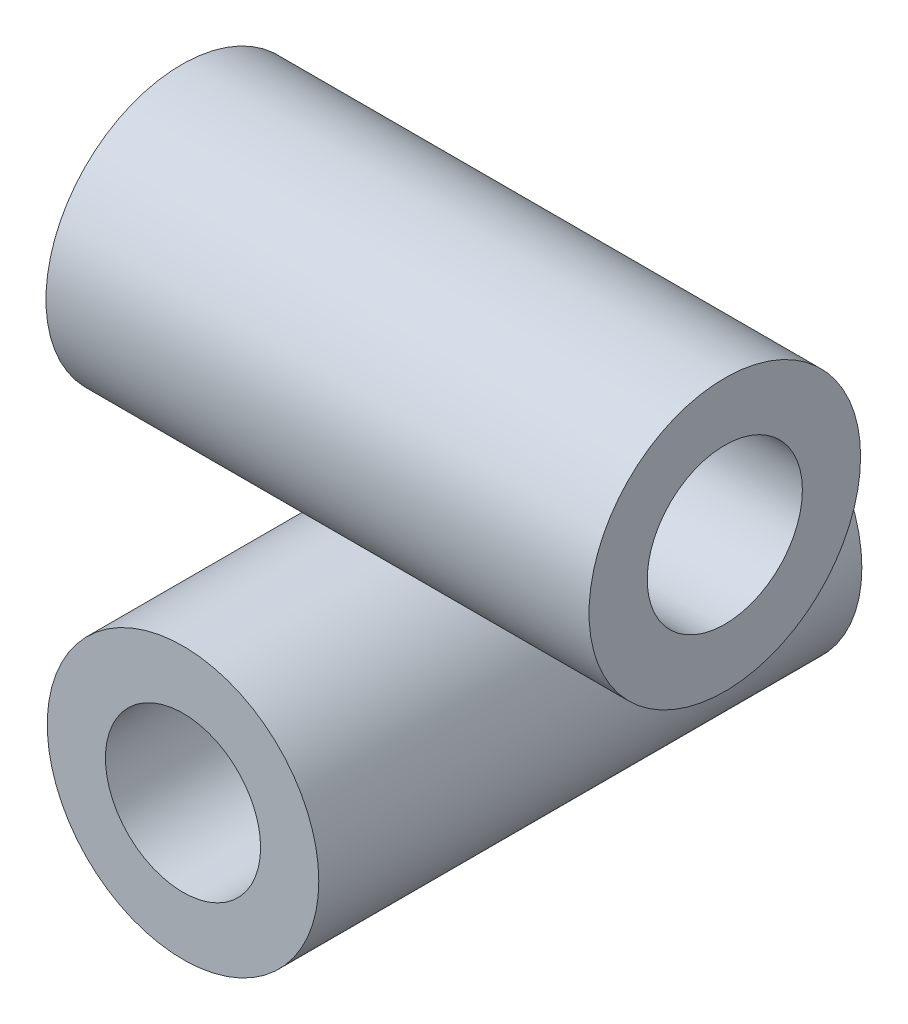
ISO-10303-21;
HEADER;
FILE_DESCRIPTION(('STEP AP214'),'2;1');
FILE_NAME('part.step','',(''),(''),'','','');
FILE_SCHEMA(('AUTOMOTIVE_DESIGN { 1 0 10303 214 1 1 1 1 }'));
ENDSEC;
DATA;
#1=APPLICATION_CONTEXT('core data for automotive mechanical design processes');
#2=APPLICATION_PROTOCOL_DEFINITION('international standard','automotive_design',2000,#1);
#3=PRODUCT_CONTEXT('',#1,'mechanical');
#4=PRODUCT('Part','Part','',(#3));
#5=PRODUCT_RELATED_PRODUCT_CATEGORY('part','',(#4));
#6=PRODUCT_DEFINITION_FORMATION('','',#4);
#7=PRODUCT_DEFINITION_CONTEXT('part definition',#1,'design');
#8=PRODUCT_DEFINITION('design','',#6,#7);
#9=PRODUCT_DEFINITION_SHAPE('','',#8);
#10=(LENGTH_UNIT() NAMED_UNIT(*) SI_UNIT(.MILLI.,.METRE.));
#11=(NAMED_UNIT(*) PLANE_ANGLE_UNIT() SI_UNIT($,.RADIAN.));
#12=(NAMED_UNIT(*) SI_UNIT($,.STERADIAN.) SOLID_ANGLE_UNIT());
#13=UNCERTAINTY_MEASURE_WITH_UNIT(LENGTH_MEASURE(1.E-05),#10,'distance_accuracy_value','');
#14=(GEOMETRIC_REPRESENTATION_CONTEXT(3) GLOBAL_UNCERTAINTY_ASSIGNED_CONTEXT((#13)) GLOBAL_UNIT_ASSIGNED_CONTEXT((#10,
#11,#12)) REPRESENTATION_CONTEXT('',''));
#15=CARTESIAN_POINT('',(0.,0.,0.));
#16=DIRECTION('',(0.,0.,1.));
#17=DIRECTION('',(1.,0.,0.));
#18=AXIS2_PLACEMENT_3D('',#15,#16,#17);
#19=CARTESIAN_POINT('',(0.,0.,56.));
#20=DIRECTION('',(0.,0.,-1.));
#21=DIRECTION('',(-1.,0.,0.));
#22=AXIS2_PLACEMENT_3D('',#19,#20,#21);
#23=CYLINDRICAL_SURFACE('',#22,14.);
#24=CARTESIAN_POINT('',(0.,0.,56.));
#25=DIRECTION('',(0.,0.,1.));
#26=DIRECTION('',(1.,0.,0.));
#27=AXIS2_PLACEMENT_3D('',#24,#25,#26);
#28=CIRCLE('',#27,14.);
#29=CARTESIAN_POINT('',(14.,0.,56.));
#30=VERTEX_POINT('',#29);
#31=EDGE_CURVE('E48',#30,#30,#28,.T.);
#32=ORIENTED_EDGE('',*,*,#31,.F.);
#33=EDGE_LOOP('',(#32));
#34=FACE_BOUND('',#33,.T.);
#35=CARTESIAN_POINT('',(0.,0.,0.));
#36=DIRECTION('',(0.,0.,1.));
#37=DIRECTION('',(1.,0.,0.));
#38=AXIS2_PLACEMENT_3D('',#35,#36,#37);
#39=CIRCLE('',#38,14.);
#40=CARTESIAN_POINT('',(14.,0.,0.));
#41=VERTEX_POINT('',#40);
#42=EDGE_CURVE('E52',#41,#41,#39,.T.);
#43=ORIENTED_EDGE('',*,*,#42,.T.);
#44=EDGE_LOOP('',(#43));
#45=FACE_BOUND('',#44,.T.);
#46=CARTESIAN_POINT('',(0.,14.,37.9306246010519));
#47=CARTESIAN_POINT('',(0.265653625682401,14.0000061462166,37.9306222719299));
#48=CARTESIAN_POINT('',(0.53124276110626,13.9924319781962,37.9229160846011));
#49=CARTESIAN_POINT('',(1.06073651250941,13.9622742798804,37.8919982606608));
#50=CARTESIAN_POINT('',(1.32464087710114,13.9396885601986,37.8687843622974));
#51=CARTESIAN_POINT('',(1.84907543869876,13.87986436212,37.8065843969487));
#52=CARTESIAN_POINT('',(2.10960336959429,13.8426165209297,37.7675882514427));
#53=CARTESIAN_POINT('',(2.62530832760412,13.7541334909963,37.6734409076748));
#54=CARTESIAN_POINT('',(2.88048557172529,13.7028988706987,37.6182903659472));
#55=CARTESIAN_POINT('',(3.38408153489981,13.5873044840194,37.4912528146237));
#56=CARTESIAN_POINT('',(3.63248830849914,13.5229230316737,37.4193381241156));
#57=CARTESIAN_POINT('',(4.12024384514522,13.3823765235029,37.2583154538406));
#58=CARTESIAN_POINT('',(4.35959254202517,13.3062113816219,37.1692073485095));
#59=CARTESIAN_POINT('',(4.82727241633906,13.1437699463866,36.9733914668309));
#60=CARTESIAN_POINT('',(5.05560891813341,13.057498609956,36.866692308233));
#61=CARTESIAN_POINT('',(5.4996142639415,12.8767888022203,36.6353534877615));
#62=CARTESIAN_POINT('',(5.71528351741018,12.7823505951445,36.510714406226));
#63=CARTESIAN_POINT('',(6.12777160984667,12.5897220445385,36.2463395380369));
#64=CARTESIAN_POINT('',(6.32489942900416,12.4916588256154,36.1069932593802));
#65=CARTESIAN_POINT('',(6.70416799328858,12.2922755292847,35.8112705042987));
#66=CARTESIAN_POINT('',(6.88630894647311,12.1909554971175,35.6548942643652));
#67=CARTESIAN_POINT('',(7.23453618366668,11.9875831851032,35.3256665448061));
#68=CARTESIAN_POINT('',(7.40062454711504,11.885531001943,35.1528172048693));
#69=CARTESIAN_POINT('',(7.71604430439232,11.6832263442117,34.7914899813623));
#70=CARTESIAN_POINT('',(7.86537604004603,11.5829738329634,34.6030124167346));
#71=CARTESIAN_POINT('',(8.14140727034204,11.3905529180027,34.2192177105987));
#72=CARTESIAN_POINT('',(8.26876132056873,11.2982217422225,34.024452091924));
#73=CARTESIAN_POINT('',(8.50754734571789,11.1195271977842,33.6228135687251));
#74=CARTESIAN_POINT('',(8.61897976485679,11.0331636626627,33.4159410022139));
#75=CARTESIAN_POINT('',(8.82608202286839,10.8682020305222,32.9914456371153));
#76=CARTESIAN_POINT('',(8.92174907258358,10.789605308565,32.7738209451301));
#77=CARTESIAN_POINT('',(9.09759917526432,10.6417522948614,32.3293404331996));
#78=CARTESIAN_POINT('',(9.1777817327717,10.5724963020121,32.1024843181569));
#79=CARTESIAN_POINT('',(9.32494051847009,10.4429569659999,31.6350806236875));
#80=CARTESIAN_POINT('',(9.39151948082091,10.3829535101473,31.3943304539412));
#81=CARTESIAN_POINT('',(9.50924098639248,10.2752471317904,30.9063970533405));
#82=CARTESIAN_POINT('',(9.56038333442579,10.2275443648226,30.6592137411855));
#83=CARTESIAN_POINT('',(9.64766223789566,10.1452557700666,30.1599980207338));
#84=CARTESIAN_POINT('',(9.68379492400535,10.1106733247529,29.9079643795739));
#85=CARTESIAN_POINT('',(9.74137092898644,10.0552120161815,29.4007303397529));
#86=CARTESIAN_POINT('',(9.76281377222967,10.034333596634,29.1455298388274));
#87=CARTESIAN_POINT('',(9.79197831782473,10.0058786909048,28.6199532543685));
#88=CARTESIAN_POINT('',(9.79891039986961,9.99906795666607,28.3494913364811));
#89=CARTESIAN_POINT('',(9.79679826792744,10.0011370874554,27.8086838258893));
#90=CARTESIAN_POINT('',(9.78775348242806,10.0100175137758,27.5383382376922));
#91=CARTESIAN_POINT('',(9.75358007120916,10.043318443024,26.9995762044012));
#92=CARTESIAN_POINT('',(9.72844863299352,10.0677416633587,26.7311601049477));
#93=CARTESIAN_POINT('',(9.66182360750928,10.1316974981474,26.1981829856618));
#94=CARTESIAN_POINT('',(9.6203300563492,10.1712300792577,25.9336219573233));
#95=CARTESIAN_POINT('',(9.51980598977111,10.265383955378,25.4062885005632));
#96=CARTESIAN_POINT('',(9.46051924977155,10.3202248247784,25.1436039302531));
#97=CARTESIAN_POINT('',(9.32411917246128,10.4436225871967,24.6261910005553));
#98=CARTESIAN_POINT('',(9.24700556769575,10.5121796859958,24.3714627606008));
#99=CARTESIAN_POINT('',(9.07443294549385,10.661504235706,23.8721002603008));
#100=CARTESIAN_POINT('',(8.97898091719401,10.7422670322898,23.6274621973977));
#101=CARTESIAN_POINT('',(8.76923979221033,10.9141560717485,23.1501951468999));
#102=CARTESIAN_POINT('',(8.65495166749281,11.005281779809,22.9175655404666));
#103=CARTESIAN_POINT('',(8.4121890134244,11.191852023947,22.4752227727514));
#104=CARTESIAN_POINT('',(8.28446162900408,11.2869795836708,22.2649657512558));
#105=CARTESIAN_POINT('',(8.01136452021495,11.4824308198131,21.8588108876252));
#106=CARTESIAN_POINT('',(7.86599529081987,11.5827543504041,21.6629126428761));
#107=CARTESIAN_POINT('',(7.55796055760866,11.7860621792847,21.2868337312741));
#108=CARTESIAN_POINT('',(7.39530046506685,11.8890456375413,21.1066481789912));
#109=CARTESIAN_POINT('',(7.05329016730623,12.0950788773866,20.7629293772995));
#110=CARTESIAN_POINT('',(6.87394044100788,12.1981286569879,20.5993956503371));
#111=CARTESIAN_POINT('',(6.50844215468242,12.3968289283756,20.2970037900836));
#112=CARTESIAN_POINT('',(6.32302167775145,12.4925983320302,20.1573423548533));
#113=CARTESIAN_POINT('',(5.93904520662669,12.6796426433914,19.8940005640616));
#114=CARTESIAN_POINT('',(5.74048966269325,12.7709177049737,19.7703196611283));
#115=CARTESIAN_POINT('',(5.33150989472197,12.946990954193,19.5389387785335));
#116=CARTESIAN_POINT('',(5.12108379051915,13.0317881107661,19.4312413403392));
#117=CARTESIAN_POINT('',(4.68982661838452,13.1931244143261,19.2316592502811));
#118=CARTESIAN_POINT('',(4.46899526833468,13.2696633372218,19.1397750274767));
#119=CARTESIAN_POINT('',(4.01533929046206,13.4139660582042,18.9703270459658));
#120=CARTESIAN_POINT('',(3.782391173264,13.4815941146914,18.8929785146196));
#121=CARTESIAN_POINT('',(3.3089861928744,13.6055313705104,18.7537684937176));
#122=CARTESIAN_POINT('',(3.0685292965747,13.6618405199259,18.6919070724593));
#123=CARTESIAN_POINT('',(2.58166451302407,13.7621509825648,18.5832194911466));
#124=CARTESIAN_POINT('',(2.33525519459824,13.8061493031753,18.5363969864615));
#125=CARTESIAN_POINT('',(1.83813711102002,13.8810823508571,18.4574153367916));
#126=CARTESIAN_POINT('',(1.58742819374582,13.9120166147197,18.4252567117367));
#127=CARTESIAN_POINT('',(1.06969141960708,13.9616250677975,18.3739576904148));
#128=CARTESIAN_POINT('',(0.802512357409188,13.9795485342942,18.3556124403505));
#129=CARTESIAN_POINT('',(0.266946809293396,14.0000200308446,18.33467539266));
#130=CARTESIAN_POINT('',(-0.00143971823833539,14.0025675268582,18.3320841422034));
#131=CARTESIAN_POINT('',(-0.537670209571301,13.9922420007729,18.342628081935));
#132=CARTESIAN_POINT('',(-0.805514035505357,13.979365457774,18.3557668628727));
#133=CARTESIAN_POINT('',(-1.33878142122563,13.9384066058108,18.3979237404275));
#134=CARTESIAN_POINT('',(-1.60420496562753,13.9103242002601,18.4269419379094));
#135=CARTESIAN_POINT('',(-2.13741822054242,13.8385550555527,18.5020993358643));
#136=CARTESIAN_POINT('',(-2.40509982136039,13.7944939760986,18.5486503931388));
#137=CARTESIAN_POINT('',(-2.93398322416574,13.6917606293025,18.6592348183291));
#138=CARTESIAN_POINT('',(-3.19518488349135,13.6330880405882,18.7232685707703));
#139=CARTESIAN_POINT('',(-3.70899111990866,13.5023565609293,18.8693465495226));
#140=CARTESIAN_POINT('',(-3.96159806753154,13.4303013970687,18.9513857624166));
#141=CARTESIAN_POINT('',(-4.4562374804576,13.274380677201,19.1340270584009));
#142=CARTESIAN_POINT('',(-4.69827041786625,13.1905156491851,19.2346283116887));
#143=CARTESIAN_POINT('',(-5.16241488138565,13.0157230440553,19.4513972581819));
#144=CARTESIAN_POINT('',(-5.3849122112351,12.9250971000249,19.5669819817074));
#145=CARTESIAN_POINT('',(-5.81639827071367,12.7367548106969,19.816194796279));
#146=CARTESIAN_POINT('',(-6.02538729197647,12.6390386185689,19.949822497599));
#147=CARTESIAN_POINT('',(-6.4282454030819,12.4389802963323,20.2349993439391));
#148=CARTESIAN_POINT('',(-6.6221205876318,12.3366400574605,20.3865412023267));
#149=CARTESIAN_POINT('',(-6.9935738104778,12.129926233368,20.7071883665586));
#150=CARTESIAN_POINT('',(-7.17115249698701,12.0255527292233,20.8762929732523));
#151=CARTESIAN_POINT('',(-7.50022509928616,11.8229437641512,21.221999260063));
#152=CARTESIAN_POINT('',(-7.6525979088896,11.724673023838,21.3977449847899));
#153=CARTESIAN_POINT('',(-7.94136990952331,11.531039557853,21.7633793107636));
#154=CARTESIAN_POINT('',(-8.07776969156548,11.4356767246833,21.9532673883089));
#155=CARTESIAN_POINT('',(-8.3343983550777,11.2500178869455,22.3460309991045));
#156=CARTESIAN_POINT('',(-8.45462545104495,11.1597224424695,22.5489079627151));
#157=CARTESIAN_POINT('',(-8.67893356341241,10.9861836239808,22.966268559834));
#158=CARTESIAN_POINT('',(-8.7830142576988,10.9029403906718,23.18075242478));
#159=CARTESIAN_POINT('',(-8.97533167893849,10.7451807660293,23.6199879059003));
#160=CARTESIAN_POINT('',(-9.06355710965934,10.6706706097013,23.8447467006604));
#161=CARTESIAN_POINT('',(-9.22443999878293,10.5319038038921,24.3028273602358));
#162=CARTESIAN_POINT('',(-9.29709752173525,10.4676471118969,24.5361491895413));
#163=CARTESIAN_POINT('',(-9.42728687852161,10.350552349971,25.00982797119));
#164=CARTESIAN_POINT('',(-9.4848152107117,10.2977169239897,25.2501865379021));
#165=CARTESIAN_POINT('',(-9.58514737958999,10.2043933772676,25.7363132114171));
#166=CARTESIAN_POINT('',(-9.62795066708362,10.1639057170633,25.9820815196214));
#167=CARTESIAN_POINT('',(-9.70104938111141,10.0941732829005,26.490363296955));
#168=CARTESIAN_POINT('',(-9.73057814271784,10.065623087909,26.7530826885105));
#169=CARTESIAN_POINT('',(-9.77404567361178,10.0234199401654,27.2809975966761));
#170=CARTESIAN_POINT('',(-9.78798394181542,10.0097674662318,27.546193192596));
#171=CARTESIAN_POINT('',(-9.80042359464047,9.99758843604618,28.0773620765399));
#172=CARTESIAN_POINT('',(-9.79892098875057,9.99906578991902,28.3433355478407));
#173=CARTESIAN_POINT('',(-9.7804525366921,10.0171309604912,28.8742329137237));
#174=CARTESIAN_POINT('',(-9.76348647470867,10.0337189880819,29.1391567936054));
#175=CARTESIAN_POINT('',(-9.71305881992138,10.0825476928584,29.6751933099964));
#176=CARTESIAN_POINT('',(-9.67905368770212,10.1153035657654,29.946208329839));
#177=CARTESIAN_POINT('',(-9.59393622275113,10.1960691084791,30.4832455044989));
#178=CARTESIAN_POINT('',(-9.54282341667619,10.244079200345,30.7492675209522));
#179=CARTESIAN_POINT('',(-9.42300299965825,10.3544020164341,31.274255157961));
#180=CARTESIAN_POINT('',(-9.35429814074336,10.4167125034046,31.5332218752141));
#181=CARTESIAN_POINT('',(-9.19873583229601,10.5543373129412,32.0420924194974));
#182=CARTESIAN_POINT('',(-9.1118790320065,10.6296511703972,32.2919965702946));
#183=CARTESIAN_POINT('',(-8.92153716710734,10.7898704847719,32.7755049228204));
#184=CARTESIAN_POINT('',(-8.81844558300058,10.8745375392219,33.0093429045182));
#185=CARTESIAN_POINT('',(-8.59400103191975,11.05276742261,33.464542290479));
#186=CARTESIAN_POINT('',(-8.47264831635913,11.1463301290689,33.6859038664556));
#187=CARTESIAN_POINT('',(-8.21159575142979,11.3400212848104,34.1143194964824));
#188=CARTESIAN_POINT('',(-8.07190508634968,11.4401464349041,34.3213806339911));
#189=CARTESIAN_POINT('',(-7.77428448378383,11.6444431460891,34.7197998601238));
#190=CARTESIAN_POINT('',(-7.61635544459948,11.7486145077234,34.9111587213445));
#191=CARTESIAN_POINT('',(-7.29182703098229,11.9525713330889,35.2670355996671));
#192=CARTESIAN_POINT('',(-7.12616234016655,12.0522882768103,35.4324464390163));
#193=CARTESIAN_POINT('',(-6.77972779642315,12.250514432198,35.7474025989977));
#194=CARTESIAN_POINT('',(-6.59895848551667,12.3490236870564,35.8969484884984));
#195=CARTESIAN_POINT('',(-6.22330399058176,12.5425328129504,36.1797659813634));
#196=CARTESIAN_POINT('',(-6.02841620067101,12.6375320312189,36.3130345681312));
#197=CARTESIAN_POINT('',(-5.62581593682958,12.8218252522349,36.5631192460704));
#198=CARTESIAN_POINT('',(-5.41810342602271,12.911119238576,36.6799352899312));
#199=CARTESIAN_POINT('',(-4.99391796183225,13.0809914605497,36.8958786650131));
#200=CARTESIAN_POINT('',(-4.77758399235389,13.161663299239,36.9952056866293));
#201=CARTESIAN_POINT('',(-4.33530049590754,13.3138978148135,37.1781832749112));
#202=CARTESIAN_POINT('',(-4.10935077092842,13.3854603039945,37.2618335185633));
#203=CARTESIAN_POINT('',(-3.64945504180728,13.5180883909165,37.4138139341604));
#204=CARTESIAN_POINT('',(-3.41551181649661,13.5791575928799,37.4821493688826));
#205=CARTESIAN_POINT('',(-2.94117892130996,13.6897346261259,37.6039462267018));
#206=CARTESIAN_POINT('',(-2.70078984997094,13.7392435267384,37.6574090256079));
#207=CARTESIAN_POINT('',(-2.05729400849336,13.8539808946448,37.7799174954342));
#208=CARTESIAN_POINT('',(-1.64981952416552,13.908563379139,37.8365636490559));
#209=CARTESIAN_POINT('',(-0.828178215213613,13.9815697724652,37.9119207268414));
#210=CARTESIAN_POINT('',(-0.414010790623904,13.9999904213617,37.9306282308975));
#211=CARTESIAN_POINT('',(0.,14.,37.9306246010519));
#212=B_SPLINE_CURVE_WITH_KNOTS('',3,(#46,#47,#48,#49,#50,#51,#52,#53,#54,#55,#56,#57,#58,#59,
#60,#61,#62,#63,#64,#65,#66,#67,#68,#69,#70,#71,#72,#73,#74,#75,#76,#77,#78,#79,#80,#81,#82,#83,
#84,#85,#86,#87,#88,#89,#90,#91,#92,#93,#94,#95,#96,#97,#98,#99,#100,#101,#102,#103,#104,#105,
#106,#107,#108,#109,#110,#111,#112,#113,#114,#115,#116,#117,#118,#119,#120,#121,#122,#123,#124,
#125,#126,#127,#128,#129,#130,#131,#132,#133,#134,#135,#136,#137,#138,#139,#140,#141,#142,#143,
#144,#145,#146,#147,#148,#149,#150,#151,#152,#153,#154,#155,#156,#157,#158,#159,#160,#161,#162,
#163,#164,#165,#166,#167,#168,#169,#170,#171,#172,#173,#174,#175,#176,#177,#178,#179,#180,#181,
#182,#183,#184,#185,#186,#187,#188,#189,#190,#191,#192,#193,#194,#195,#196,#197,#198,#199,#200,
#201,#202,#203,#204,#205,#206,#207,#208,#209,#210,#211),.UNSPECIFIED.,.T.,.F.,(4,2,2,2,2,2,2,2,
2,2,2,2,2,2,2,2,2,2,2,2,2,2,2,2,2,2,2,2,2,2,2,2,2,2,2,2,2,2,2,2,2,2,2,2,2,2,2,2,2,2,2,2,2,2,2,2,
2,2,2,2,2,2,2,2,2,2,2,2,2,2,2,2,2,2,2,2,2,2,2,2,2,2,4),(0.,0.796629318500467,1.59337484831941,
2.39062998357745,3.18785272191003,3.98640127483004,4.78495565980524,5.58311999402602,
6.38125851424349,7.16195228871619,7.94263522325166,8.72321689283528,9.50378263614186,
10.253975038176,11.0041465056155,11.7544505487828,12.5047785954943,13.2746021236641,
14.0444353854189,14.8144669788074,15.5845235031235,16.3954973322548,17.2065001715114,
18.0176448404963,18.8287877194274,19.6522225657887,20.4756697668687,21.2988037562443,
22.1218952841596,22.9121751466017,23.702432841443,24.4924439447096,25.2824323850539,
26.0348804467882,26.7873027285134,27.5398445220246,28.2924067309991,29.0553590540993,
29.8183147417311,30.5814557338092,31.3446237821022,32.1489282599941,32.9532606729172,
33.7577767286367,34.5622978946345,35.3870331578789,36.2117865623317,37.0363106141993,
37.8607978152463,38.6595848932557,39.4583547203205,40.256800756324,41.0552150193835,
41.8118307555995,42.5684184877136,43.3250896804691,44.0817759665516,44.8389992419494,
45.596219377594,46.3536146175409,47.1110381027173,47.9078706554734,48.7047288179689,
49.5017929242121,50.2988681548064,51.1231636729717,51.9474820000203,52.7716714528132,
53.5958314317537,54.4024411651479,55.2090397944117,56.0152359811026,56.8213924768347,
57.5838298888439,58.3462399529357,59.1087910972196,59.8713444342439,60.6245290532098,
61.3777291895382,62.1306700981275,62.8835413319349,64.1249450772167,65.3664607280547),.UNSPECIFIED.);
#213=CARTESIAN_POINT('',(0.,14.,37.9306246010519));
#214=VERTEX_POINT('',#213);
#215=EDGE_CURVE('E10',#214,#214,#212,.T.);
#216=ORIENTED_EDGE('',*,*,#215,.F.);
#217=EDGE_LOOP('',(#216));
#218=FACE_BOUND('',#217,.T.);
#219=ADVANCED_FACE('F37',(#34,#45,#218),#23,.T.);
#220=CARTESIAN_POINT('',(0.,0.,56.));
#221=DIRECTION('',(0.,0.,1.));
#222=DIRECTION('',(1.,0.,0.));
#223=AXIS2_PLACEMENT_3D('',#220,#221,#222);
#224=PLANE('',#223);
#225=ORIENTED_EDGE('',*,*,#31,.T.);
#226=EDGE_LOOP('',(#225));
#227=FACE_BOUND('',#226,.T.);
#228=CARTESIAN_POINT('',(0.,0.,56.));
#229=DIRECTION('',(0.,0.,1.));
#230=DIRECTION('',(1.,0.,0.));
#231=AXIS2_PLACEMENT_3D('',#228,#229,#230);
#232=CIRCLE('',#231,8.);
#233=CARTESIAN_POINT('',(8.,0.,56.));
#234=VERTEX_POINT('',#233);
#235=EDGE_CURVE('E57',#234,#234,#232,.T.);
#236=ORIENTED_EDGE('',*,*,#235,.F.);
#237=EDGE_LOOP('',(#236));
#238=FACE_BOUND('',#237,.T.);
#239=ADVANCED_FACE('F96',(#227,#238),#224,.T.);
#240=CARTESIAN_POINT('',(0.,0.,0.));
#241=DIRECTION('',(0.,0.,1.));
#242=DIRECTION('',(1.,0.,0.));
#243=AXIS2_PLACEMENT_3D('',#240,#241,#242);
#244=PLANE('',#243);
#245=ORIENTED_EDGE('',*,*,#42,.F.);
#246=EDGE_LOOP('',(#245));
#247=FACE_BOUND('',#246,.T.);
#248=CARTESIAN_POINT('',(0.,0.,0.));
#249=DIRECTION('',(0.,0.,1.));
#250=DIRECTION('',(1.,0.,0.));
#251=AXIS2_PLACEMENT_3D('',#248,#249,#250);
#252=CIRCLE('',#251,8.);
#253=CARTESIAN_POINT('',(8.,0.,0.));
#254=VERTEX_POINT('',#253);
#255=EDGE_CURVE('E59',#254,#254,#252,.T.);
#256=ORIENTED_EDGE('',*,*,#255,.T.);
#257=EDGE_LOOP('',(#256));
#258=FACE_BOUND('',#257,.T.);
#259=ADVANCED_FACE('F102',(#247,#258),#244,.F.);
#260=CARTESIAN_POINT('',(0.,0.,56.));
#261=DIRECTION('',(0.,0.,-1.));
#262=DIRECTION('',(-1.,0.,0.));
#263=AXIS2_PLACEMENT_3D('',#260,#261,#262);
#264=CYLINDRICAL_SURFACE('',#263,8.);
#265=ORIENTED_EDGE('',*,*,#235,.T.);
#266=EDGE_LOOP('',(#265));
#267=FACE_BOUND('',#266,.T.);
#268=ORIENTED_EDGE('',*,*,#255,.F.);
#269=EDGE_LOOP('',(#268));
#270=FACE_BOUND('',#269,.T.);
#271=ADVANCED_FACE('F92',(#267,#270),#264,.F.);
#272=CARTESIAN_POINT('',(28.,24.,28.1326656299192));
#273=DIRECTION('',(-1.,0.,0.));
#274=DIRECTION('',(0.,0.,1.));
#275=AXIS2_PLACEMENT_3D('',#272,#273,#274);
#276=CYLINDRICAL_SURFACE('',#275,14.);
#277=CARTESIAN_POINT('',(-28.,24.,28.1326656299192));
#278=DIRECTION('',(1.,0.,0.));
#279=DIRECTION('',(0.,0.,-1.));
#280=AXIS2_PLACEMENT_3D('',#277,#278,#279);
#281=CIRCLE('',#280,14.);
#282=CARTESIAN_POINT('',(-28.,24.,14.1326656299192));
#283=VERTEX_POINT('',#282);
#284=EDGE_CURVE('E65',#283,#283,#281,.T.);
#285=ORIENTED_EDGE('',*,*,#284,.T.);
#286=EDGE_LOOP('',(#285));
#287=FACE_BOUND('',#286,.T.);
#288=CARTESIAN_POINT('',(28.,24.,28.1326656299192));
#289=DIRECTION('',(1.,0.,0.));
#290=DIRECTION('',(0.,0.,-1.));
#291=AXIS2_PLACEMENT_3D('',#288,#289,#290);
#292=CIRCLE('',#291,14.);
#293=CARTESIAN_POINT('',(28.,24.,14.1326656299192));
#294=VERTEX_POINT('',#293);
#295=EDGE_CURVE('E62',#294,#294,#292,.T.);
#296=ORIENTED_EDGE('',*,*,#295,.F.);
#297=EDGE_LOOP('',(#296));
#298=FACE_BOUND('',#297,.T.);
#299=ORIENTED_EDGE('',*,*,#215,.T.);
#300=EDGE_LOOP('',(#299));
#301=FACE_BOUND('',#300,.T.);
#302=ADVANCED_FACE('F83',(#287,#298,#301),#276,.T.);
#303=CARTESIAN_POINT('',(28.,24.,28.1326656299192));
#304=DIRECTION('',(1.,0.,0.));
#305=DIRECTION('',(0.,0.,-1.));
#306=AXIS2_PLACEMENT_3D('',#303,#304,#305);
#307=PLANE('',#306);
#308=ORIENTED_EDGE('',*,*,#295,.T.);
#309=EDGE_LOOP('',(#308));
#310=FACE_BOUND('',#309,.T.);
#311=CARTESIAN_POINT('',(28.,24.,28.1326656299192));
#312=DIRECTION('',(1.,0.,0.));
#313=DIRECTION('',(0.,0.,-1.));
#314=AXIS2_PLACEMENT_3D('',#311,#312,#313);
#315=CIRCLE('',#314,8.);
#316=CARTESIAN_POINT('',(28.,24.,20.1326656299192));
#317=VERTEX_POINT('',#316);
#318=EDGE_CURVE('E68',#317,#317,#315,.T.);
#319=ORIENTED_EDGE('',*,*,#318,.F.);
#320=EDGE_LOOP('',(#319));
#321=FACE_BOUND('',#320,.T.);
#322=ADVANCED_FACE('F80',(#310,#321),#307,.T.);
#323=CARTESIAN_POINT('',(-28.,24.,28.1326656299192));
#324=DIRECTION('',(1.,0.,0.));
#325=DIRECTION('',(0.,0.,-1.));
#326=AXIS2_PLACEMENT_3D('',#323,#324,#325);
#327=PLANE('',#326);
#328=ORIENTED_EDGE('',*,*,#284,.F.);
#329=EDGE_LOOP('',(#328));
#330=FACE_BOUND('',#329,.T.);
#331=CARTESIAN_POINT('',(-28.,24.,28.1326656299192));
#332=DIRECTION('',(1.,0.,0.));
#333=DIRECTION('',(0.,0.,-1.));
#334=AXIS2_PLACEMENT_3D('',#331,#332,#333);
#335=CIRCLE('',#334,8.);
#336=CARTESIAN_POINT('',(-28.,24.,20.1326656299192));
#337=VERTEX_POINT('',#336);
#338=EDGE_CURVE('E71',#337,#337,#335,.T.);
#339=ORIENTED_EDGE('',*,*,#338,.T.);
#340=EDGE_LOOP('',(#339));
#341=FACE_BOUND('',#340,.T.);
#342=ADVANCED_FACE('F82',(#330,#341),#327,.F.);
#343=CARTESIAN_POINT('',(28.,24.,28.1326656299192));
#344=DIRECTION('',(-1.,0.,0.));
#345=DIRECTION('',(0.,0.,1.));
#346=AXIS2_PLACEMENT_3D('',#343,#344,#345);
#347=CYLINDRICAL_SURFACE('',#346,8.);
#348=ORIENTED_EDGE('',*,*,#318,.T.);
#349=EDGE_LOOP('',(#348));
#350=FACE_BOUND('',#349,.T.);
#351=ORIENTED_EDGE('',*,*,#338,.F.);
#352=EDGE_LOOP('',(#351));
#353=FACE_BOUND('',#352,.T.);
#354=ADVANCED_FACE('F77',(#350,#353),#347,.F.);
#355=CLOSED_SHELL('',(#219,#239,#259,#271,#302,#322,#342,#354));
#356=MANIFOLD_SOLID_BREP('B2',#355);
#357=ADVANCED_BREP_SHAPE_REPRESENTATION('',(#18,#356),#14);
#358=SHAPE_DEFINITION_REPRESENTATION(#9,#357);
ENDSEC;
END-ISO-10303-21;
